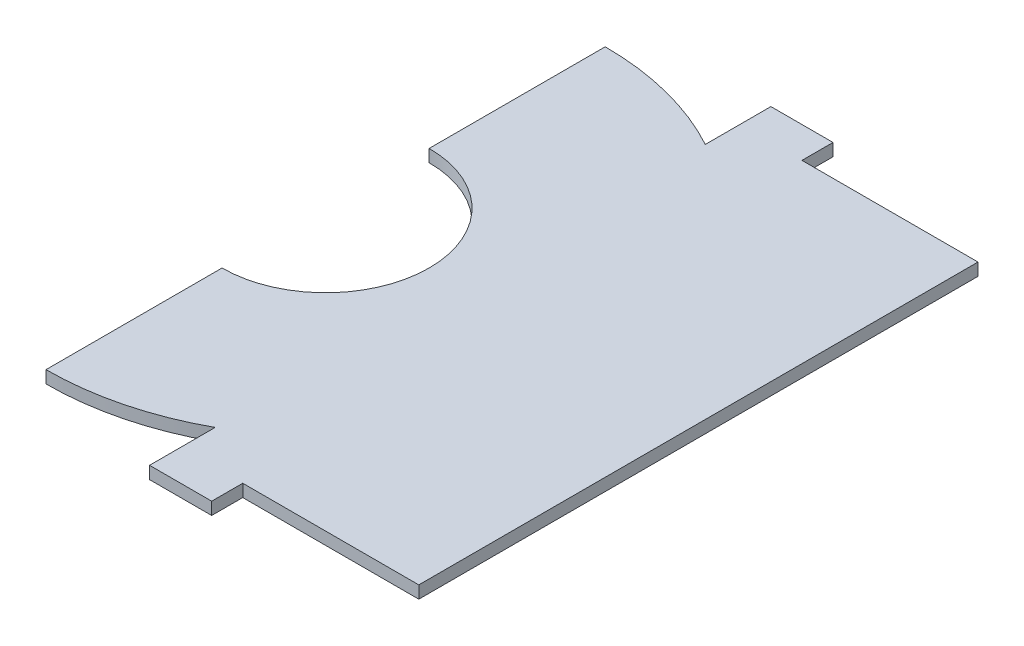
ISO-10303-21;
HEADER;
FILE_DESCRIPTION(('STEP AP214'),'2;1');
FILE_NAME('part.step','',(''),(''),'','','');
FILE_SCHEMA(('AUTOMOTIVE_DESIGN { 1 0 10303 214 1 1 1 1 }'));
ENDSEC;
DATA;
#1=APPLICATION_CONTEXT('core data for automotive mechanical design processes');
#2=APPLICATION_PROTOCOL_DEFINITION('international standard','automotive_design',2000,#1);
#3=PRODUCT_CONTEXT('',#1,'mechanical');
#4=PRODUCT('Part','Part','',(#3));
#5=PRODUCT_RELATED_PRODUCT_CATEGORY('part','',(#4));
#6=PRODUCT_DEFINITION_FORMATION('','',#4);
#7=PRODUCT_DEFINITION_CONTEXT('part definition',#1,'design');
#8=PRODUCT_DEFINITION('design','',#6,#7);
#9=PRODUCT_DEFINITION_SHAPE('','',#8);
#10=(LENGTH_UNIT() NAMED_UNIT(*) SI_UNIT(.MILLI.,.METRE.));
#11=(NAMED_UNIT(*) PLANE_ANGLE_UNIT() SI_UNIT($,.RADIAN.));
#12=(NAMED_UNIT(*) SI_UNIT($,.STERADIAN.) SOLID_ANGLE_UNIT());
#13=UNCERTAINTY_MEASURE_WITH_UNIT(LENGTH_MEASURE(1.E-05),#10,'distance_accuracy_value','');
#14=(GEOMETRIC_REPRESENTATION_CONTEXT(3) GLOBAL_UNCERTAINTY_ASSIGNED_CONTEXT((#13)) GLOBAL_UNIT_ASSIGNED_CONTEXT((#10,
#11,#12)) REPRESENTATION_CONTEXT('',''));
#15=CARTESIAN_POINT('',(0.,0.,0.));
#16=DIRECTION('',(0.,0.,1.));
#17=DIRECTION('',(1.,0.,0.));
#18=AXIS2_PLACEMENT_3D('',#15,#16,#17);
#19=CARTESIAN_POINT('',(-0.391666665,0.085,-0.25));
#20=DIRECTION('',(1.,0.,0.));
#21=DIRECTION('',(0.,1.,0.));
#22=AXIS2_PLACEMENT_3D('',#19,#20,#21);
#23=PLANE('',#22);
#24=DIRECTION('',(0.,0.,1.));
#25=VECTOR('',#24,1.);
#26=CARTESIAN_POINT('',(-0.391666665,0.075,-0.25));
#27=LINE('',#26,#25);
#28=CARTESIAN_POINT('',(-0.391666665,0.075,-0.25));
#29=VERTEX_POINT('',#28);
#30=CARTESIAN_POINT('',(-0.391666665,0.075,-0.197202658521));
#31=VERTEX_POINT('',#30);
#32=EDGE_CURVE('E202',#29,#31,#27,.T.);
#33=ORIENTED_EDGE('',*,*,#32,.T.);
#34=DIRECTION('',(0.,1.,0.));
#35=VECTOR('',#34,1.);
#36=CARTESIAN_POINT('',(-0.391666665,0.075,-0.197202658521));
#37=LINE('',#36,#35);
#38=CARTESIAN_POINT('',(-0.391666665,0.085,-0.197202658521));
#39=VERTEX_POINT('',#38);
#40=EDGE_CURVE('E227',#31,#39,#37,.T.);
#41=ORIENTED_EDGE('',*,*,#40,.T.);
#42=DIRECTION('',(0.,0.,1.));
#43=VECTOR('',#42,1.);
#44=CARTESIAN_POINT('',(-0.391666665,0.085,-0.25));
#45=LINE('',#44,#43);
#46=CARTESIAN_POINT('',(-0.391666665,0.085,-0.25));
#47=VERTEX_POINT('',#46);
#48=EDGE_CURVE('E190',#47,#39,#45,.T.);
#49=ORIENTED_EDGE('',*,*,#48,.F.);
#50=DIRECTION('',(0.,-1.,0.));
#51=VECTOR('',#50,1.);
#52=CARTESIAN_POINT('',(-0.391666665,0.085,-0.25));
#53=LINE('',#52,#51);
#54=EDGE_CURVE('E11',#47,#29,#53,.T.);
#55=ORIENTED_EDGE('',*,*,#54,.T.);
#56=EDGE_LOOP('',(#33,#41,#49,#55));
#57=FACE_BOUND('',#56,.T.);
#58=ADVANCED_FACE('F17',(#57),#23,.F.);
#59=CARTESIAN_POINT('',(-0.391666665,0.085,-0.25));
#60=DIRECTION('',(0.,0.,1.));
#61=DIRECTION('',(1.,0.,0.));
#62=AXIS2_PLACEMENT_3D('',#59,#60,#61);
#63=PLANE('',#62);
#64=DIRECTION('',(-1.,0.,0.));
#65=VECTOR('',#64,1.);
#66=CARTESIAN_POINT('',(-0.341666665,0.075,-0.25));
#67=LINE('',#66,#65);
#68=CARTESIAN_POINT('',(-0.341666665,0.075,-0.25));
#69=VERTEX_POINT('',#68);
#70=EDGE_CURVE('E205',#69,#29,#67,.T.);
#71=ORIENTED_EDGE('',*,*,#70,.T.);
#72=ORIENTED_EDGE('',*,*,#54,.F.);
#73=DIRECTION('',(-1.,0.,0.));
#74=VECTOR('',#73,1.);
#75=CARTESIAN_POINT('',(-0.341666665,0.085,-0.25));
#76=LINE('',#75,#74);
#77=CARTESIAN_POINT('',(-0.341666665,0.085,-0.25));
#78=VERTEX_POINT('',#77);
#79=EDGE_CURVE('E194',#78,#47,#76,.T.);
#80=ORIENTED_EDGE('',*,*,#79,.F.);
#81=DIRECTION('',(0.,-1.,0.));
#82=VECTOR('',#81,1.);
#83=CARTESIAN_POINT('',(-0.341666665,0.085,-0.25));
#84=LINE('',#83,#82);
#85=EDGE_CURVE('E26',#78,#69,#84,.T.);
#86=ORIENTED_EDGE('',*,*,#85,.T.);
#87=EDGE_LOOP('',(#71,#72,#80,#86));
#88=FACE_BOUND('',#87,.T.);
#89=ADVANCED_FACE('F305',(#88),#63,.F.);
#90=CARTESIAN_POINT('',(-0.341666665,0.085,-0.25));
#91=DIRECTION('',(-1.,0.,0.));
#92=DIRECTION('',(0.,0.,1.));
#93=AXIS2_PLACEMENT_3D('',#90,#91,#92);
#94=PLANE('',#93);
#95=DIRECTION('',(0.,0.,-1.));
#96=VECTOR('',#95,1.);
#97=CARTESIAN_POINT('',(-0.341666665,0.075,-0.225));
#98=LINE('',#97,#96);
#99=CARTESIAN_POINT('',(-0.341666665,0.075,-0.225));
#100=VERTEX_POINT('',#99);
#101=EDGE_CURVE('E238',#100,#69,#98,.T.);
#102=ORIENTED_EDGE('',*,*,#101,.T.);
#103=ORIENTED_EDGE('',*,*,#85,.F.);
#104=DIRECTION('',(0.,0.,-1.));
#105=VECTOR('',#104,1.);
#106=CARTESIAN_POINT('',(-0.341666665,0.085,-0.225));
#107=LINE('',#106,#105);
#108=CARTESIAN_POINT('',(-0.341666665,0.085,-0.225));
#109=VERTEX_POINT('',#108);
#110=EDGE_CURVE('E181',#109,#78,#107,.T.);
#111=ORIENTED_EDGE('',*,*,#110,.F.);
#112=DIRECTION('',(0.,-1.,0.));
#113=VECTOR('',#112,1.);
#114=CARTESIAN_POINT('',(-0.341666665,0.085,-0.225));
#115=LINE('',#114,#113);
#116=EDGE_CURVE('E298',#109,#100,#115,.T.);
#117=ORIENTED_EDGE('',*,*,#116,.T.);
#118=EDGE_LOOP('',(#102,#103,#111,#117));
#119=FACE_BOUND('',#118,.T.);
#120=ADVANCED_FACE('F19',(#119),#94,.F.);
#121=CARTESIAN_POINT('',(-0.341666665,0.085,-0.225));
#122=DIRECTION('',(0.,0.,1.));
#123=DIRECTION('',(1.,0.,0.));
#124=AXIS2_PLACEMENT_3D('',#121,#122,#123);
#125=PLANE('',#124);
#126=DIRECTION('',(-1.,0.,0.));
#127=VECTOR('',#126,1.);
#128=CARTESIAN_POINT('',(-0.2,0.075,-0.225));
#129=LINE('',#128,#127);
#130=CARTESIAN_POINT('',(-0.2,0.075,-0.225));
#131=VERTEX_POINT('',#130);
#132=EDGE_CURVE('E242',#131,#100,#129,.T.);
#133=ORIENTED_EDGE('',*,*,#132,.T.);
#134=ORIENTED_EDGE('',*,*,#116,.F.);
#135=DIRECTION('',(-1.,0.,0.));
#136=VECTOR('',#135,1.);
#137=CARTESIAN_POINT('',(-0.2,0.085,-0.225));
#138=LINE('',#137,#136);
#139=CARTESIAN_POINT('',(-0.2,0.085,-0.225));
#140=VERTEX_POINT('',#139);
#141=EDGE_CURVE('E216',#140,#109,#138,.T.);
#142=ORIENTED_EDGE('',*,*,#141,.F.);
#143=DIRECTION('',(0.,-1.,0.));
#144=VECTOR('',#143,1.);
#145=CARTESIAN_POINT('',(-0.2,0.085,-0.225));
#146=LINE('',#145,#144);
#147=EDGE_CURVE('E281',#140,#131,#146,.T.);
#148=ORIENTED_EDGE('',*,*,#147,.T.);
#149=EDGE_LOOP('',(#133,#134,#142,#148));
#150=FACE_BOUND('',#149,.T.);
#151=ADVANCED_FACE('F550',(#150),#125,.F.);
#152=CARTESIAN_POINT('',(-0.2,0.085,-0.225));
#153=DIRECTION('',(-1.,0.,0.));
#154=DIRECTION('',(0.,0.,1.));
#155=AXIS2_PLACEMENT_3D('',#152,#153,#154);
#156=PLANE('',#155);
#157=DIRECTION('',(0.,0.,-1.));
#158=VECTOR('',#157,1.);
#159=CARTESIAN_POINT('',(-0.2,0.075,0.225));
#160=LINE('',#159,#158);
#161=CARTESIAN_POINT('',(-0.2,0.075,0.225));
#162=VERTEX_POINT('',#161);
#163=EDGE_CURVE('E246',#162,#131,#160,.T.);
#164=ORIENTED_EDGE('',*,*,#163,.T.);
#165=ORIENTED_EDGE('',*,*,#147,.F.);
#166=DIRECTION('',(0.,0.,-1.));
#167=VECTOR('',#166,1.);
#168=CARTESIAN_POINT('',(-0.2,0.085,0.225));
#169=LINE('',#168,#167);
#170=CARTESIAN_POINT('',(-0.2,0.085,0.225));
#171=VERTEX_POINT('',#170);
#172=EDGE_CURVE('E220',#171,#140,#169,.T.);
#173=ORIENTED_EDGE('',*,*,#172,.F.);
#174=DIRECTION('',(0.,-1.,0.));
#175=VECTOR('',#174,1.);
#176=CARTESIAN_POINT('',(-0.2,0.085,0.225));
#177=LINE('',#176,#175);
#178=EDGE_CURVE('E278',#171,#162,#177,.T.);
#179=ORIENTED_EDGE('',*,*,#178,.T.);
#180=EDGE_LOOP('',(#164,#165,#173,#179));
#181=FACE_BOUND('',#180,.T.);
#182=ADVANCED_FACE('F485',(#181),#156,.F.);
#183=CARTESIAN_POINT('',(-0.341666665,0.085,0.225));
#184=DIRECTION('',(0.,0.,-1.));
#185=DIRECTION('',(0.,-1.,0.));
#186=AXIS2_PLACEMENT_3D('',#183,#184,#185);
#187=PLANE('',#186);
#188=DIRECTION('',(1.,0.,0.));
#189=VECTOR('',#188,1.);
#190=CARTESIAN_POINT('',(-0.341666665,0.075,0.225));
#191=LINE('',#190,#189);
#192=CARTESIAN_POINT('',(-0.341666665,0.075,0.225));
#193=VERTEX_POINT('',#192);
#194=EDGE_CURVE('E250',#193,#162,#191,.T.);
#195=ORIENTED_EDGE('',*,*,#194,.T.);
#196=ORIENTED_EDGE('',*,*,#178,.F.);
#197=DIRECTION('',(1.,0.,0.));
#198=VECTOR('',#197,1.);
#199=CARTESIAN_POINT('',(-0.341666665,0.085,0.225));
#200=LINE('',#199,#198);
#201=CARTESIAN_POINT('',(-0.341666665,0.085,0.225));
#202=VERTEX_POINT('',#201);
#203=EDGE_CURVE('E201',#202,#171,#200,.T.);
#204=ORIENTED_EDGE('',*,*,#203,.F.);
#205=DIRECTION('',(0.,-1.,0.));
#206=VECTOR('',#205,1.);
#207=CARTESIAN_POINT('',(-0.341666665,0.085,0.225));
#208=LINE('',#207,#206);
#209=EDGE_CURVE('E282',#202,#193,#208,.T.);
#210=ORIENTED_EDGE('',*,*,#209,.T.);
#211=EDGE_LOOP('',(#195,#196,#204,#210));
#212=FACE_BOUND('',#211,.T.);
#213=ADVANCED_FACE('F479',(#212),#187,.F.);
#214=CARTESIAN_POINT('',(-0.341666665,0.085,0.25));
#215=DIRECTION('',(-1.,0.,0.));
#216=DIRECTION('',(0.,0.,1.));
#217=AXIS2_PLACEMENT_3D('',#214,#215,#216);
#218=PLANE('',#217);
#219=DIRECTION('',(0.,0.,-1.));
#220=VECTOR('',#219,1.);
#221=CARTESIAN_POINT('',(-0.341666665,0.075,0.25));
#222=LINE('',#221,#220);
#223=CARTESIAN_POINT('',(-0.341666665,0.075,0.25));
#224=VERTEX_POINT('',#223);
#225=EDGE_CURVE('E254',#224,#193,#222,.T.);
#226=ORIENTED_EDGE('',*,*,#225,.T.);
#227=ORIENTED_EDGE('',*,*,#209,.F.);
#228=DIRECTION('',(0.,0.,-1.));
#229=VECTOR('',#228,1.);
#230=CARTESIAN_POINT('',(-0.341666665,0.085,0.25));
#231=LINE('',#230,#229);
#232=CARTESIAN_POINT('',(-0.341666665,0.085,0.25));
#233=VERTEX_POINT('',#232);
#234=EDGE_CURVE('E188',#233,#202,#231,.T.);
#235=ORIENTED_EDGE('',*,*,#234,.F.);
#236=DIRECTION('',(0.,-1.,0.));
#237=VECTOR('',#236,1.);
#238=CARTESIAN_POINT('',(-0.341666665,0.085,0.25));
#239=LINE('',#238,#237);
#240=EDGE_CURVE('E291',#233,#224,#239,.T.);
#241=ORIENTED_EDGE('',*,*,#240,.T.);
#242=EDGE_LOOP('',(#226,#227,#235,#241));
#243=FACE_BOUND('',#242,.T.);
#244=ADVANCED_FACE('F484',(#243),#218,.F.);
#245=CARTESIAN_POINT('',(-0.391666665,0.085,0.25));
#246=DIRECTION('',(0.,0.,-1.));
#247=DIRECTION('',(0.,-1.,0.));
#248=AXIS2_PLACEMENT_3D('',#245,#246,#247);
#249=PLANE('',#248);
#250=DIRECTION('',(1.,0.,0.));
#251=VECTOR('',#250,1.);
#252=CARTESIAN_POINT('',(-0.391666665,0.075,0.25));
#253=LINE('',#252,#251);
#254=CARTESIAN_POINT('',(-0.391666665,0.075,0.25));
#255=VERTEX_POINT('',#254);
#256=EDGE_CURVE('E258',#255,#224,#253,.T.);
#257=ORIENTED_EDGE('',*,*,#256,.T.);
#258=ORIENTED_EDGE('',*,*,#240,.F.);
#259=DIRECTION('',(1.,0.,0.));
#260=VECTOR('',#259,1.);
#261=CARTESIAN_POINT('',(-0.391666665,0.085,0.25));
#262=LINE('',#261,#260);
#263=CARTESIAN_POINT('',(-0.391666665,0.085,0.25));
#264=VERTEX_POINT('',#263);
#265=EDGE_CURVE('E184',#264,#233,#262,.T.);
#266=ORIENTED_EDGE('',*,*,#265,.F.);
#267=DIRECTION('',(0.,-1.,0.));
#268=VECTOR('',#267,1.);
#269=CARTESIAN_POINT('',(-0.391666665,0.085,0.25));
#270=LINE('',#269,#268);
#271=EDGE_CURVE('E288',#264,#255,#270,.T.);
#272=ORIENTED_EDGE('',*,*,#271,.T.);
#273=EDGE_LOOP('',(#257,#258,#266,#272));
#274=FACE_BOUND('',#273,.T.);
#275=ADVANCED_FACE('F513',(#274),#249,.F.);
#276=CARTESIAN_POINT('',(-0.391666665,0.085,0.25));
#277=DIRECTION('',(1.,0.,0.));
#278=DIRECTION('',(0.,1.,0.));
#279=AXIS2_PLACEMENT_3D('',#276,#277,#278);
#280=PLANE('',#279);
#281=DIRECTION('',(0.,0.,1.));
#282=VECTOR('',#281,1.);
#283=CARTESIAN_POINT('',(-0.391666665,0.075,0.197202658521));
#284=LINE('',#283,#282);
#285=CARTESIAN_POINT('',(-0.391666665,0.075,0.197202658521));
#286=VERTEX_POINT('',#285);
#287=EDGE_CURVE('E262',#286,#255,#284,.T.);
#288=ORIENTED_EDGE('',*,*,#287,.T.);
#289=ORIENTED_EDGE('',*,*,#271,.F.);
#290=DIRECTION('',(0.,0.,1.));
#291=VECTOR('',#290,1.);
#292=CARTESIAN_POINT('',(-0.391666665,0.085,0.197202658521));
#293=LINE('',#292,#291);
#294=CARTESIAN_POINT('',(-0.391666665,0.085,0.197202658521));
#295=VERTEX_POINT('',#294);
#296=EDGE_CURVE('E189',#295,#264,#293,.T.);
#297=ORIENTED_EDGE('',*,*,#296,.F.);
#298=DIRECTION('',(0.,-1.,0.));
#299=VECTOR('',#298,1.);
#300=CARTESIAN_POINT('',(-0.391666665,0.085,0.197202658521));
#301=LINE('',#300,#299);
#302=EDGE_CURVE('E285',#295,#286,#301,.T.);
#303=ORIENTED_EDGE('',*,*,#302,.T.);
#304=EDGE_LOOP('',(#288,#289,#297,#303));
#305=FACE_BOUND('',#304,.T.);
#306=ADVANCED_FACE('F507',(#305),#280,.F.);
#307=CARTESIAN_POINT('',(-0.5,0.085,0.));
#308=DIRECTION('',(0.,-1.,0.));
#309=DIRECTION('',(0.,0.,-1.));
#310=AXIS2_PLACEMENT_3D('',#307,#308,#309);
#311=CYLINDRICAL_SURFACE('',#310,0.225);
#312=ORIENTED_EDGE('',*,*,#302,.F.);
#313=CARTESIAN_POINT('',(-0.5,0.085,0.));
#314=DIRECTION('',(0.,-1.,0.));
#315=DIRECTION('',(0.481481488888824,0.,0.87645626009368));
#316=AXIS2_PLACEMENT_3D('',#313,#314,#315);
#317=CIRCLE('',#316,0.225);
#318=CARTESIAN_POINT('',(-0.5,0.085,0.225));
#319=VERTEX_POINT('',#318);
#320=EDGE_CURVE('E197',#295,#319,#317,.T.);
#321=ORIENTED_EDGE('',*,*,#320,.T.);
#322=DIRECTION('',(0.,1.,0.));
#323=VECTOR('',#322,1.);
#324=CARTESIAN_POINT('',(-0.5,0.075,0.225));
#325=LINE('',#324,#323);
#326=CARTESIAN_POINT('',(-0.5,0.075,0.225));
#327=VERTEX_POINT('',#326);
#328=EDGE_CURVE('E277',#327,#319,#325,.T.);
#329=ORIENTED_EDGE('',*,*,#328,.F.);
#330=CARTESIAN_POINT('',(-0.5,0.075,0.));
#331=DIRECTION('',(0.,1.,0.));
#332=DIRECTION('',(0.,0.,1.));
#333=AXIS2_PLACEMENT_3D('',#330,#331,#332);
#334=CIRCLE('',#333,0.225);
#335=EDGE_CURVE('E263',#327,#286,#334,.T.);
#336=ORIENTED_EDGE('',*,*,#335,.T.);
#337=EDGE_LOOP('',(#312,#321,#329,#336));
#338=FACE_BOUND('',#337,.T.);
#339=ADVANCED_FACE('F512',(#338),#311,.T.);
#340=CARTESIAN_POINT('',(-0.5,0.085,0.225));
#341=DIRECTION('',(1.,0.,0.));
#342=DIRECTION('',(0.,1.,0.));
#343=AXIS2_PLACEMENT_3D('',#340,#341,#342);
#344=PLANE('',#343);
#345=DIRECTION('',(0.,0.,1.));
#346=VECTOR('',#345,1.);
#347=CARTESIAN_POINT('',(-0.5,0.075,0.083333335));
#348=LINE('',#347,#346);
#349=CARTESIAN_POINT('',(-0.5,0.075,0.083333335));
#350=VERTEX_POINT('',#349);
#351=EDGE_CURVE('E267',#350,#327,#348,.T.);
#352=ORIENTED_EDGE('',*,*,#351,.T.);
#353=ORIENTED_EDGE('',*,*,#328,.T.);
#354=DIRECTION('',(0.,0.,1.));
#355=VECTOR('',#354,1.);
#356=CARTESIAN_POINT('',(-0.5,0.085,0.083333335));
#357=LINE('',#356,#355);
#358=CARTESIAN_POINT('',(-0.5,0.085,0.083333335));
#359=VERTEX_POINT('',#358);
#360=EDGE_CURVE('E167',#359,#319,#357,.T.);
#361=ORIENTED_EDGE('',*,*,#360,.F.);
#362=DIRECTION('',(0.,-1.,0.));
#363=VECTOR('',#362,1.);
#364=CARTESIAN_POINT('',(-0.5,0.085,0.083333335));
#365=LINE('',#364,#363);
#366=EDGE_CURVE('E48',#359,#350,#365,.T.);
#367=ORIENTED_EDGE('',*,*,#366,.T.);
#368=EDGE_LOOP('',(#352,#353,#361,#367));
#369=FACE_BOUND('',#368,.T.);
#370=ADVANCED_FACE('F496',(#369),#344,.F.);
#371=CARTESIAN_POINT('',(-0.5,0.085,0.));
#372=DIRECTION('',(0.,-1.,0.));
#373=DIRECTION('',(0.,0.,-1.));
#374=AXIS2_PLACEMENT_3D('',#371,#372,#373);
#375=CYLINDRICAL_SURFACE('',#374,0.083333335);
#376=CARTESIAN_POINT('',(-0.5,0.075,0.));
#377=DIRECTION('',(0.,-1.,0.));
#378=DIRECTION('',(0.,0.,-1.));
#379=AXIS2_PLACEMENT_3D('',#376,#377,#378);
#380=CIRCLE('',#379,0.083333335);
#381=CARTESIAN_POINT('',(-0.5,0.075,-0.083333335));
#382=VERTEX_POINT('',#381);
#383=EDGE_CURVE('E270',#382,#350,#380,.T.);
#384=ORIENTED_EDGE('',*,*,#383,.T.);
#385=ORIENTED_EDGE('',*,*,#366,.F.);
#386=CARTESIAN_POINT('',(-0.5,0.085,0.));
#387=DIRECTION('',(0.,1.,0.));
#388=DIRECTION('',(0.,0.,1.));
#389=AXIS2_PLACEMENT_3D('',#386,#387,#388);
#390=CIRCLE('',#389,0.083333335);
#391=CARTESIAN_POINT('',(-0.5,0.085,-0.083333335));
#392=VERTEX_POINT('',#391);
#393=EDGE_CURVE('E162',#359,#392,#390,.T.);
#394=ORIENTED_EDGE('',*,*,#393,.T.);
#395=DIRECTION('',(0.,1.,0.));
#396=VECTOR('',#395,1.);
#397=CARTESIAN_POINT('',(-0.5,0.075,-0.083333335));
#398=LINE('',#397,#396);
#399=EDGE_CURVE('E38',#382,#392,#398,.T.);
#400=ORIENTED_EDGE('',*,*,#399,.F.);
#401=EDGE_LOOP('',(#384,#385,#394,#400));
#402=FACE_BOUND('',#401,.T.);
#403=ADVANCED_FACE('F163',(#402),#375,.F.);
#404=CARTESIAN_POINT('',(-0.5,0.085,-0.225));
#405=DIRECTION('',(1.,0.,0.));
#406=DIRECTION('',(0.,1.,0.));
#407=AXIS2_PLACEMENT_3D('',#404,#405,#406);
#408=PLANE('',#407);
#409=DIRECTION('',(0.,0.,1.));
#410=VECTOR('',#409,1.);
#411=CARTESIAN_POINT('',(-0.5,0.075,-0.225));
#412=LINE('',#411,#410);
#413=CARTESIAN_POINT('',(-0.5,0.075,-0.225));
#414=VERTEX_POINT('',#413);
#415=EDGE_CURVE('E157',#414,#382,#412,.T.);
#416=ORIENTED_EDGE('',*,*,#415,.T.);
#417=ORIENTED_EDGE('',*,*,#399,.T.);
#418=DIRECTION('',(0.,0.,1.));
#419=VECTOR('',#418,1.);
#420=CARTESIAN_POINT('',(-0.5,0.085,-0.225));
#421=LINE('',#420,#419);
#422=CARTESIAN_POINT('',(-0.5,0.085,-0.225));
#423=VERTEX_POINT('',#422);
#424=EDGE_CURVE('E155',#423,#392,#421,.T.);
#425=ORIENTED_EDGE('',*,*,#424,.F.);
#426=DIRECTION('',(0.,-1.,0.));
#427=VECTOR('',#426,1.);
#428=CARTESIAN_POINT('',(-0.5,0.085,-0.225));
#429=LINE('',#428,#427);
#430=EDGE_CURVE('E193',#423,#414,#429,.T.);
#431=ORIENTED_EDGE('',*,*,#430,.T.);
#432=EDGE_LOOP('',(#416,#417,#425,#431));
#433=FACE_BOUND('',#432,.T.);
#434=ADVANCED_FACE('F152',(#433),#408,.F.);
#435=CARTESIAN_POINT('',(-0.5,0.075,0.));
#436=DIRECTION('',(0.,-1.,0.));
#437=DIRECTION('',(0.,0.,-1.));
#438=AXIS2_PLACEMENT_3D('',#435,#436,#437);
#439=PLANE('',#438);
#440=CARTESIAN_POINT('',(-0.5,0.075,0.));
#441=DIRECTION('',(0.,1.,0.));
#442=DIRECTION('',(0.481481488888824,0.,-0.87645626009368));
#443=AXIS2_PLACEMENT_3D('',#440,#441,#442);
#444=CIRCLE('',#443,0.225);
#445=EDGE_CURVE('E206',#31,#414,#444,.T.);
#446=ORIENTED_EDGE('',*,*,#445,.F.);
#447=ORIENTED_EDGE('',*,*,#32,.F.);
#448=ORIENTED_EDGE('',*,*,#70,.F.);
#449=ORIENTED_EDGE('',*,*,#101,.F.);
#450=ORIENTED_EDGE('',*,*,#132,.F.);
#451=ORIENTED_EDGE('',*,*,#163,.F.);
#452=ORIENTED_EDGE('',*,*,#194,.F.);
#453=ORIENTED_EDGE('',*,*,#225,.F.);
#454=ORIENTED_EDGE('',*,*,#256,.F.);
#455=ORIENTED_EDGE('',*,*,#287,.F.);
#456=ORIENTED_EDGE('',*,*,#335,.F.);
#457=ORIENTED_EDGE('',*,*,#351,.F.);
#458=ORIENTED_EDGE('',*,*,#383,.F.);
#459=ORIENTED_EDGE('',*,*,#415,.F.);
#460=EDGE_LOOP('',(#446,#447,#448,#449,#450,#451,#452,#453,#454,#455,#456,#457,#458,#459));
#461=FACE_BOUND('',#460,.T.);
#462=ADVANCED_FACE('F315',(#461),#439,.T.);
#463=CARTESIAN_POINT('',(-0.5,0.085,0.));
#464=DIRECTION('',(0.,-1.,0.));
#465=DIRECTION('',(0.,0.,-1.));
#466=AXIS2_PLACEMENT_3D('',#463,#464,#465);
#467=CYLINDRICAL_SURFACE('',#466,0.225);
#468=ORIENTED_EDGE('',*,*,#430,.F.);
#469=CARTESIAN_POINT('',(-0.5,0.085,0.));
#470=DIRECTION('',(0.,-1.,0.));
#471=DIRECTION('',(0.,0.,-1.));
#472=AXIS2_PLACEMENT_3D('',#469,#470,#471);
#473=CIRCLE('',#472,0.225);
#474=EDGE_CURVE('E172',#423,#39,#473,.T.);
#475=ORIENTED_EDGE('',*,*,#474,.T.);
#476=ORIENTED_EDGE('',*,*,#40,.F.);
#477=ORIENTED_EDGE('',*,*,#445,.T.);
#478=EDGE_LOOP('',(#468,#475,#476,#477));
#479=FACE_BOUND('',#478,.T.);
#480=ADVANCED_FACE('F450',(#479),#467,.T.);
#481=CARTESIAN_POINT('',(-0.5,0.085,0.));
#482=DIRECTION('',(0.,-1.,0.));
#483=DIRECTION('',(0.,0.,-1.));
#484=AXIS2_PLACEMENT_3D('',#481,#482,#483);
#485=PLANE('',#484);
#486=ORIENTED_EDGE('',*,*,#474,.F.);
#487=ORIENTED_EDGE('',*,*,#424,.T.);
#488=ORIENTED_EDGE('',*,*,#393,.F.);
#489=ORIENTED_EDGE('',*,*,#360,.T.);
#490=ORIENTED_EDGE('',*,*,#320,.F.);
#491=ORIENTED_EDGE('',*,*,#296,.T.);
#492=ORIENTED_EDGE('',*,*,#265,.T.);
#493=ORIENTED_EDGE('',*,*,#234,.T.);
#494=ORIENTED_EDGE('',*,*,#203,.T.);
#495=ORIENTED_EDGE('',*,*,#172,.T.);
#496=ORIENTED_EDGE('',*,*,#141,.T.);
#497=ORIENTED_EDGE('',*,*,#110,.T.);
#498=ORIENTED_EDGE('',*,*,#79,.T.);
#499=ORIENTED_EDGE('',*,*,#48,.T.);
#500=EDGE_LOOP('',(#486,#487,#488,#489,#490,#491,#492,#493,#494,#495,#496,#497,#498,#499));
#501=FACE_BOUND('',#500,.T.);
#502=ADVANCED_FACE('F169',(#501),#485,.F.);
#503=CLOSED_SHELL('',(#58,#89,#120,#151,#182,#213,#244,#275,#306,#339,#370,#403,#434,#462,#480,#502));
#504=MANIFOLD_SOLID_BREP('B1',#503);
#505=ADVANCED_BREP_SHAPE_REPRESENTATION('',(#18,#504),#14);
#506=SHAPE_DEFINITION_REPRESENTATION(#9,#505);
ENDSEC;
END-ISO-10303-21;
